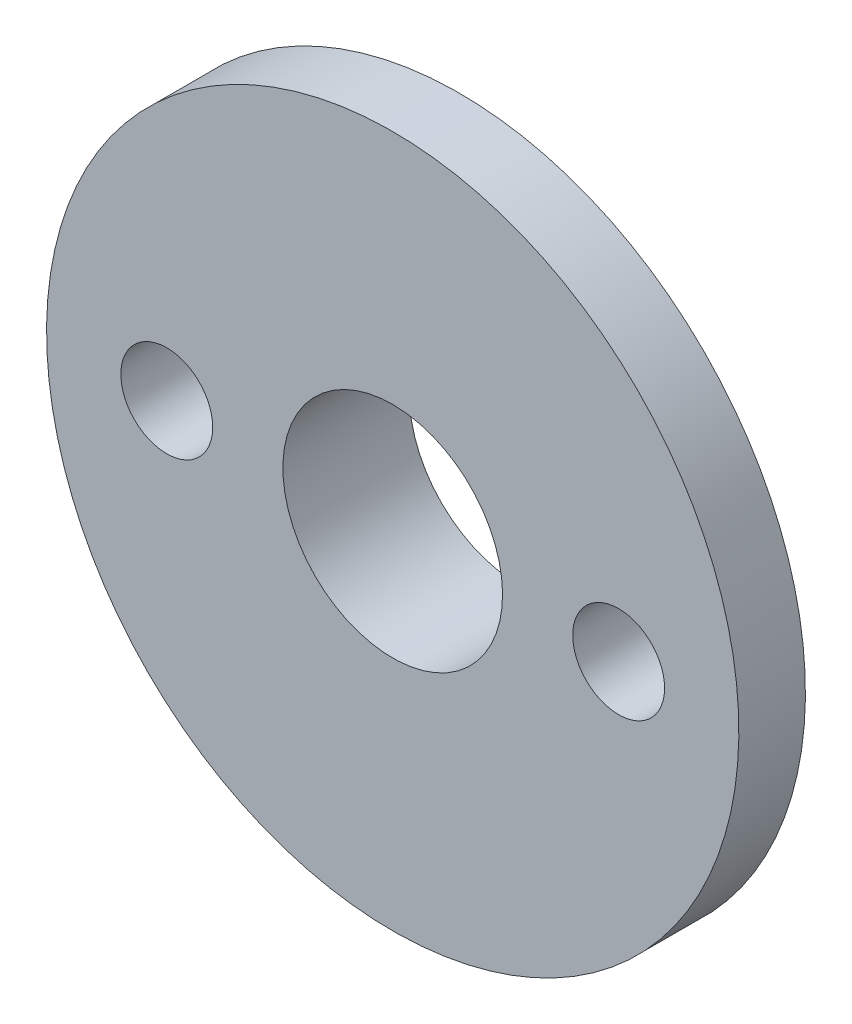
ISO-10303-21;
HEADER;
FILE_DESCRIPTION(('STEP AP214'),'2;1');
FILE_NAME('part.step','',(''),(''),'','','');
FILE_SCHEMA(('AUTOMOTIVE_DESIGN { 1 0 10303 214 1 1 1 1 }'));
ENDSEC;
DATA;
#1=APPLICATION_CONTEXT('core data for automotive mechanical design processes');
#2=APPLICATION_PROTOCOL_DEFINITION('international standard','automotive_design',2000,#1);
#3=PRODUCT_CONTEXT('',#1,'mechanical');
#4=PRODUCT('Part','Part','',(#3));
#5=PRODUCT_RELATED_PRODUCT_CATEGORY('part','',(#4));
#6=PRODUCT_DEFINITION_FORMATION('','',#4);
#7=PRODUCT_DEFINITION_CONTEXT('part definition',#1,'design');
#8=PRODUCT_DEFINITION('design','',#6,#7);
#9=PRODUCT_DEFINITION_SHAPE('','',#8);
#10=(LENGTH_UNIT() NAMED_UNIT(*) SI_UNIT(.MILLI.,.METRE.));
#11=(NAMED_UNIT(*) PLANE_ANGLE_UNIT() SI_UNIT($,.RADIAN.));
#12=(NAMED_UNIT(*) SI_UNIT($,.STERADIAN.) SOLID_ANGLE_UNIT());
#13=UNCERTAINTY_MEASURE_WITH_UNIT(LENGTH_MEASURE(1.E-05),#10,'distance_accuracy_value','');
#14=(GEOMETRIC_REPRESENTATION_CONTEXT(3) GLOBAL_UNCERTAINTY_ASSIGNED_CONTEXT((#13)) GLOBAL_UNIT_ASSIGNED_CONTEXT((#10,
#11,#12)) REPRESENTATION_CONTEXT('',''));
#15=CARTESIAN_POINT('',(0.,0.,0.));
#16=DIRECTION('',(0.,0.,1.));
#17=DIRECTION('',(1.,0.,0.));
#18=AXIS2_PLACEMENT_3D('',#15,#16,#17);
#19=CARTESIAN_POINT('',(-36.4750880356761,41.2248544872212,245.850002717972));
#20=DIRECTION('',(0.,0.,-1.));
#21=DIRECTION('',(0.707106781186547,0.707106781186548,0.));
#22=AXIS2_PLACEMENT_3D('',#19,#20,#21);
#23=PLANE('',#22);
#24=CARTESIAN_POINT('',(-36.4750880356761,41.2248544872212,245.850002717972));
#25=DIRECTION('',(0.,0.,-1.));
#26=DIRECTION('',(-0.707106781186547,-0.707106781186548,0.));
#27=AXIS2_PLACEMENT_3D('',#24,#25,#26);
#28=CIRCLE('',#27,8.);
#29=CARTESIAN_POINT('',(-28.6365515668759,39.6256840687575,245.850002717972));
#30=VERTEX_POINT('',#29);
#31=CARTESIAN_POINT('',(-44.3136245044762,39.6256840687575,245.850002717972));
#32=VERTEX_POINT('',#31);
#33=EDGE_CURVE('E11',#30,#32,#28,.T.);
#34=ORIENTED_EDGE('',*,*,#33,.T.);
#35=CARTESIAN_POINT('',(-44.9603694099147,41.2248544872212,245.850002717972));
#36=DIRECTION('',(0.,0.,1.));
#37=DIRECTION('',(-0.707106781186547,-0.707106781186548,0.));
#38=AXIS2_PLACEMENT_3D('',#35,#36,#37);
#39=CIRCLE('',#38,1.725);
#40=CARTESIAN_POINT('',(-44.3136245044762,42.8240249056849,245.850002717972));
#41=VERTEX_POINT('',#40);
#42=EDGE_CURVE('E26',#32,#41,#39,.T.);
#43=ORIENTED_EDGE('',*,*,#42,.T.);
#44=CARTESIAN_POINT('',(-36.4750880356761,41.2248544872212,245.850002717972));
#45=DIRECTION('',(0.,0.,-1.));
#46=DIRECTION('',(-0.707106781186547,-0.707106781186548,0.));
#47=AXIS2_PLACEMENT_3D('',#44,#45,#46);
#48=CIRCLE('',#47,8.);
#49=CARTESIAN_POINT('',(-28.6365515668759,42.8240249056849,245.850002717972));
#50=VERTEX_POINT('',#49);
#51=EDGE_CURVE('E106',#41,#50,#48,.T.);
#52=ORIENTED_EDGE('',*,*,#51,.T.);
#53=CARTESIAN_POINT('',(-27.9898066614375,41.2248544872212,245.850002717972));
#54=DIRECTION('',(0.,0.,1.));
#55=DIRECTION('',(-0.707106781186547,-0.707106781186548,0.));
#56=AXIS2_PLACEMENT_3D('',#53,#54,#55);
#57=CIRCLE('',#56,1.725);
#58=EDGE_CURVE('E103',#50,#30,#57,.T.);
#59=ORIENTED_EDGE('',*,*,#58,.T.);
#60=EDGE_LOOP('',(#34,#43,#52,#59));
#61=FACE_BOUND('',#60,.T.);
#62=CARTESIAN_POINT('',(-36.4750880356761,41.2248544872212,245.850002717972));
#63=DIRECTION('',(0.,0.,1.));
#64=DIRECTION('',(-0.707106781186547,-0.707106781186548,0.));
#65=AXIS2_PLACEMENT_3D('',#62,#63,#64);
#66=CIRCLE('',#65,4.125);
#67=CARTESIAN_POINT('',(-39.3919035080706,38.3080390148267,245.850002717972));
#68=VERTEX_POINT('',#67);
#69=EDGE_CURVE('E100',#68,#68,#66,.T.);
#70=ORIENTED_EDGE('',*,*,#69,.T.);
#71=EDGE_LOOP('',(#70));
#72=FACE_BOUND('',#71,.T.);
#73=ADVANCED_FACE('F16',(#61,#72),#23,.T.);
#74=CARTESIAN_POINT('',(-36.4750880356761,41.2248544872212,250.600002717972));
#75=DIRECTION('',(0.,0.,1.));
#76=DIRECTION('',(0.707106781186547,0.707106781186548,0.));
#77=AXIS2_PLACEMENT_3D('',#74,#75,#76);
#78=PLANE('',#77);
#79=CARTESIAN_POINT('',(-27.9898066614375,41.2248544872212,250.600002717972));
#80=DIRECTION('',(0.,0.,-1.));
#81=DIRECTION('',(-0.707106781186547,-0.707106781186548,0.));
#82=AXIS2_PLACEMENT_3D('',#79,#80,#81);
#83=CIRCLE('',#82,1.725);
#84=CARTESIAN_POINT('',(-29.2095658589843,40.0050952896744,250.600002717972));
#85=VERTEX_POINT('',#84);
#86=EDGE_CURVE('E95',#85,#85,#83,.T.);
#87=ORIENTED_EDGE('',*,*,#86,.T.);
#88=EDGE_LOOP('',(#87));
#89=FACE_BOUND('',#88,.T.);
#90=CARTESIAN_POINT('',(-36.4750880356761,41.2248544872212,250.600002717972));
#91=DIRECTION('',(0.,0.,1.));
#92=DIRECTION('',(-0.707106781186547,-0.707106781186548,0.));
#93=AXIS2_PLACEMENT_3D('',#90,#91,#92);
#94=CIRCLE('',#93,4.125);
#95=CARTESIAN_POINT('',(-39.3919035080706,38.3080390148267,250.600002717972));
#96=VERTEX_POINT('',#95);
#97=EDGE_CURVE('E80',#96,#96,#94,.T.);
#98=ORIENTED_EDGE('',*,*,#97,.F.);
#99=EDGE_LOOP('',(#98));
#100=FACE_BOUND('',#99,.T.);
#101=CARTESIAN_POINT('',(-44.9603694099147,41.2248544872212,250.600002717972));
#102=DIRECTION('',(0.,0.,-1.));
#103=DIRECTION('',(-0.707106781186547,-0.707106781186548,0.));
#104=AXIS2_PLACEMENT_3D('',#101,#102,#103);
#105=CIRCLE('',#104,1.725);
#106=CARTESIAN_POINT('',(-46.1801286074615,40.0050952896744,250.600002717972));
#107=VERTEX_POINT('',#106);
#108=EDGE_CURVE('E92',#107,#107,#105,.T.);
#109=ORIENTED_EDGE('',*,*,#108,.T.);
#110=EDGE_LOOP('',(#109));
#111=FACE_BOUND('',#110,.T.);
#112=CARTESIAN_POINT('',(-36.4750880356761,41.2248544872212,250.600002717972));
#113=DIRECTION('',(0.,0.,1.));
#114=DIRECTION('',(-0.707106781186547,-0.707106781186548,0.));
#115=AXIS2_PLACEMENT_3D('',#112,#113,#114);
#116=CIRCLE('',#115,13.);
#117=CARTESIAN_POINT('',(-45.6674761911012,32.0324663317961,250.600002717972));
#118=VERTEX_POINT('',#117);
#119=EDGE_CURVE('E84',#118,#118,#116,.T.);
#120=ORIENTED_EDGE('',*,*,#119,.T.);
#121=EDGE_LOOP('',(#120));
#122=FACE_BOUND('',#121,.T.);
#123=ADVANCED_FACE('F125',(#89,#100,#111,#122),#78,.T.);
#124=CARTESIAN_POINT('',(-44.9603694099147,41.2248544872212,248.100004267693));
#125=DIRECTION('',(0.,0.,-1.));
#126=DIRECTION('',(-0.707106781186547,-0.707106781186548,0.));
#127=AXIS2_PLACEMENT_3D('',#124,#125,#126);
#128=CYLINDRICAL_SURFACE('',#127,1.725);
#129=CARTESIAN_POINT('',(-44.9603694099147,41.2248544872212,248.100002717972));
#130=DIRECTION('',(0.,0.,1.));
#131=DIRECTION('',(-0.707106781186547,-0.707106781186548,0.));
#132=AXIS2_PLACEMENT_3D('',#129,#130,#131);
#133=CIRCLE('',#132,1.725);
#134=CARTESIAN_POINT('',(-44.3136245044762,42.8240249056849,248.100002717972));
#135=VERTEX_POINT('',#134);
#136=CARTESIAN_POINT('',(-44.3136245044762,39.6256840687575,248.100002717972));
#137=VERTEX_POINT('',#136);
#138=EDGE_CURVE('E71',#135,#137,#133,.T.);
#139=ORIENTED_EDGE('',*,*,#138,.F.);
#140=DIRECTION('',(0.,0.,1.));
#141=VECTOR('',#140,1.);
#142=CARTESIAN_POINT('',(-44.3136245044762,42.8240249056849,248.100004267693));
#143=LINE('',#142,#141);
#144=EDGE_CURVE('E86',#41,#135,#143,.T.);
#145=ORIENTED_EDGE('',*,*,#144,.F.);
#146=ORIENTED_EDGE('',*,*,#42,.F.);
#147=DIRECTION('',(0.,0.,-1.));
#148=VECTOR('',#147,1.);
#149=CARTESIAN_POINT('',(-44.3136245044762,39.6256840687575,248.100004267693));
#150=LINE('',#149,#148);
#151=EDGE_CURVE('E77',#137,#32,#150,.T.);
#152=ORIENTED_EDGE('',*,*,#151,.F.);
#153=EDGE_LOOP('',(#139,#145,#146,#152));
#154=FACE_BOUND('',#153,.T.);
#155=ORIENTED_EDGE('',*,*,#108,.F.);
#156=EDGE_LOOP('',(#155));
#157=FACE_BOUND('',#156,.T.);
#158=ADVANCED_FACE('F111',(#154,#157),#128,.F.);
#159=CARTESIAN_POINT('',(-36.4750880356761,41.2248544872212,248.100002717972));
#160=DIRECTION('',(0.,0.,-1.));
#161=DIRECTION('',(-0.707106781186548,-0.707106781186548,0.));
#162=AXIS2_PLACEMENT_3D('',#159,#160,#161);
#163=PLANE('',#162);
#164=CARTESIAN_POINT('',(-36.4750880356761,41.2248544872212,248.100002717972));
#165=DIRECTION('',(0.,0.,1.));
#166=DIRECTION('',(-0.707106781186547,-0.707106781186548,0.));
#167=AXIS2_PLACEMENT_3D('',#164,#165,#166);
#168=CIRCLE('',#167,8.);
#169=CARTESIAN_POINT('',(-28.6365515668759,42.8240249056849,248.100002717972));
#170=VERTEX_POINT('',#169);
#171=EDGE_CURVE('E83',#170,#135,#168,.T.);
#172=ORIENTED_EDGE('',*,*,#171,.T.);
#173=ORIENTED_EDGE('',*,*,#138,.T.);
#174=CARTESIAN_POINT('',(-36.4750880356761,41.2248544872212,248.100002717972));
#175=DIRECTION('',(0.,0.,1.));
#176=DIRECTION('',(-0.707106781186547,-0.707106781186548,0.));
#177=AXIS2_PLACEMENT_3D('',#174,#175,#176);
#178=CIRCLE('',#177,8.);
#179=CARTESIAN_POINT('',(-28.6365515668759,39.6256840687575,248.100002717972));
#180=VERTEX_POINT('',#179);
#181=EDGE_CURVE('E63',#137,#180,#178,.T.);
#182=ORIENTED_EDGE('',*,*,#181,.T.);
#183=CARTESIAN_POINT('',(-27.9898066614375,41.2248544872212,248.100002717972));
#184=DIRECTION('',(0.,0.,1.));
#185=DIRECTION('',(-0.707106781186547,-0.707106781186548,0.));
#186=AXIS2_PLACEMENT_3D('',#183,#184,#185);
#187=CIRCLE('',#186,1.725);
#188=EDGE_CURVE('E53',#180,#170,#187,.T.);
#189=ORIENTED_EDGE('',*,*,#188,.T.);
#190=EDGE_LOOP('',(#172,#173,#182,#189));
#191=FACE_BOUND('',#190,.T.);
#192=CARTESIAN_POINT('',(-36.4750880356761,41.2248544872212,248.100002717972));
#193=DIRECTION('',(0.,0.,-1.));
#194=DIRECTION('',(-0.707106781186547,-0.707106781186548,0.));
#195=AXIS2_PLACEMENT_3D('',#192,#193,#194);
#196=CIRCLE('',#195,13.);
#197=CARTESIAN_POINT('',(-45.6674761911012,32.0324663317961,248.100002717972));
#198=VERTEX_POINT('',#197);
#199=EDGE_CURVE('E64',#198,#198,#196,.T.);
#200=ORIENTED_EDGE('',*,*,#199,.T.);
#201=EDGE_LOOP('',(#200));
#202=FACE_BOUND('',#201,.T.);
#203=ADVANCED_FACE('F68',(#191,#202),#163,.T.);
#204=CARTESIAN_POINT('',(-36.4750880356761,41.2248544872212,245.600002717972));
#205=DIRECTION('',(0.,0.,1.));
#206=DIRECTION('',(-0.707106781186547,-0.707106781186548,0.));
#207=AXIS2_PLACEMENT_3D('',#204,#205,#206);
#208=CYLINDRICAL_SURFACE('',#207,8.);
#209=ORIENTED_EDGE('',*,*,#33,.F.);
#210=DIRECTION('',(0.,0.,1.));
#211=VECTOR('',#210,1.);
#212=CARTESIAN_POINT('',(-28.6365515668759,39.6256840687575,248.100004267693));
#213=LINE('',#212,#211);
#214=EDGE_CURVE('E61',#30,#180,#213,.T.);
#215=ORIENTED_EDGE('',*,*,#214,.T.);
#216=ORIENTED_EDGE('',*,*,#181,.F.);
#217=ORIENTED_EDGE('',*,*,#151,.T.);
#218=EDGE_LOOP('',(#209,#215,#216,#217));
#219=FACE_BOUND('',#218,.T.);
#220=ADVANCED_FACE('F76',(#219),#208,.T.);
#221=CARTESIAN_POINT('',(-36.4750880356761,41.2248544872212,237.100002717972));
#222=DIRECTION('',(0.,0.,1.));
#223=DIRECTION('',(-0.707106781186547,-0.707106781186548,0.));
#224=AXIS2_PLACEMENT_3D('',#221,#222,#223);
#225=CYLINDRICAL_SURFACE('',#224,4.125);
#226=ORIENTED_EDGE('',*,*,#97,.T.);
#227=EDGE_LOOP('',(#226));
#228=FACE_BOUND('',#227,.T.);
#229=ORIENTED_EDGE('',*,*,#69,.F.);
#230=EDGE_LOOP('',(#229));
#231=FACE_BOUND('',#230,.T.);
#232=ADVANCED_FACE('F122',(#228,#231),#225,.F.);
#233=CARTESIAN_POINT('',(-27.9898066614375,41.2248544872212,248.100004267693));
#234=DIRECTION('',(0.,0.,-1.));
#235=DIRECTION('',(-0.707106781186547,-0.707106781186548,0.));
#236=AXIS2_PLACEMENT_3D('',#233,#234,#235);
#237=CYLINDRICAL_SURFACE('',#236,1.725);
#238=ORIENTED_EDGE('',*,*,#214,.F.);
#239=ORIENTED_EDGE('',*,*,#58,.F.);
#240=DIRECTION('',(0.,0.,-1.));
#241=VECTOR('',#240,1.);
#242=CARTESIAN_POINT('',(-28.6365515668759,42.8240249056849,248.100004267693));
#243=LINE('',#242,#241);
#244=EDGE_CURVE('E20',#170,#50,#243,.T.);
#245=ORIENTED_EDGE('',*,*,#244,.F.);
#246=ORIENTED_EDGE('',*,*,#188,.F.);
#247=EDGE_LOOP('',(#238,#239,#245,#246));
#248=FACE_BOUND('',#247,.T.);
#249=ORIENTED_EDGE('',*,*,#86,.F.);
#250=EDGE_LOOP('',(#249));
#251=FACE_BOUND('',#250,.T.);
#252=ADVANCED_FACE('F58',(#248,#251),#237,.F.);
#253=CARTESIAN_POINT('',(-36.4750880356761,41.2248544872212,245.600002717972));
#254=DIRECTION('',(0.,0.,1.));
#255=DIRECTION('',(-0.707106781186547,-0.707106781186548,0.));
#256=AXIS2_PLACEMENT_3D('',#253,#254,#255);
#257=CYLINDRICAL_SURFACE('',#256,8.);
#258=ORIENTED_EDGE('',*,*,#171,.F.);
#259=ORIENTED_EDGE('',*,*,#244,.T.);
#260=ORIENTED_EDGE('',*,*,#51,.F.);
#261=ORIENTED_EDGE('',*,*,#144,.T.);
#262=EDGE_LOOP('',(#258,#259,#260,#261));
#263=FACE_BOUND('',#262,.T.);
#264=ADVANCED_FACE('F114',(#263),#257,.T.);
#265=CARTESIAN_POINT('',(-36.4750880356761,41.2248544872212,248.100002717972));
#266=DIRECTION('',(0.,0.,-1.));
#267=DIRECTION('',(-0.707106781186547,-0.707106781186548,0.));
#268=AXIS2_PLACEMENT_3D('',#265,#266,#267);
#269=CYLINDRICAL_SURFACE('',#268,13.);
#270=ORIENTED_EDGE('',*,*,#119,.F.);
#271=EDGE_LOOP('',(#270));
#272=FACE_BOUND('',#271,.T.);
#273=ORIENTED_EDGE('',*,*,#199,.F.);
#274=EDGE_LOOP('',(#273));
#275=FACE_BOUND('',#274,.T.);
#276=ADVANCED_FACE('F18',(#272,#275),#269,.T.);
#277=CLOSED_SHELL('',(#73,#123,#158,#203,#220,#232,#252,#264,#276));
#278=MANIFOLD_SOLID_BREP('B1',#277);
#279=ADVANCED_BREP_SHAPE_REPRESENTATION('',(#18,#278),#14);
#280=SHAPE_DEFINITION_REPRESENTATION(#9,#279);
ENDSEC;
END-ISO-10303-21;
